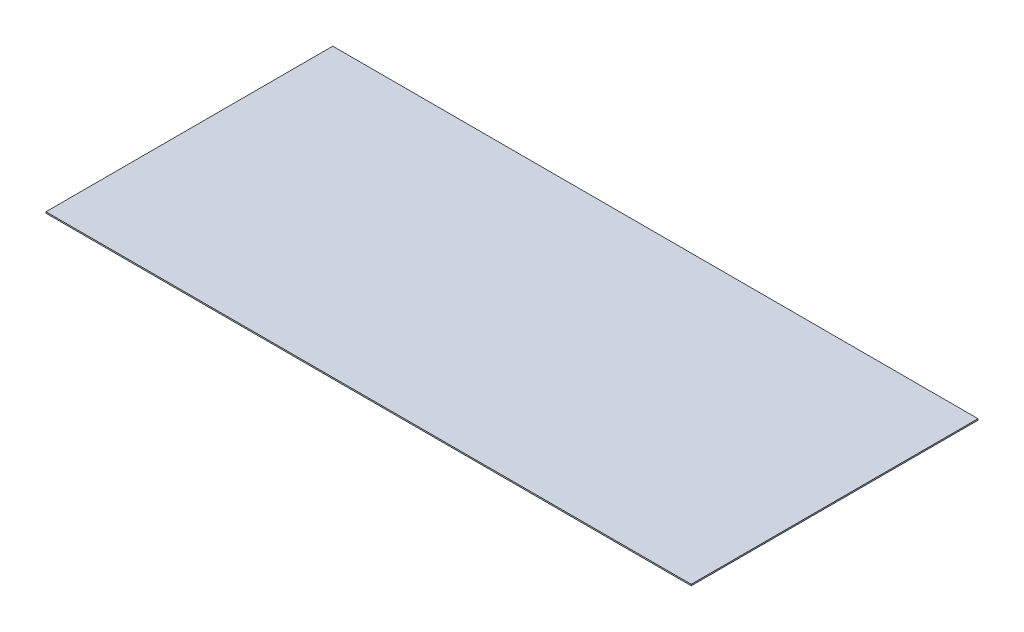
ISO-10303-21;
HEADER;
FILE_DESCRIPTION(('STEP AP214'),'2;1');
FILE_NAME('part.step','',(''),(''),'','','');
FILE_SCHEMA(('AUTOMOTIVE_DESIGN { 1 0 10303 214 1 1 1 1 }'));
ENDSEC;
DATA;
#1=APPLICATION_CONTEXT('core data for automotive mechanical design processes');
#2=APPLICATION_PROTOCOL_DEFINITION('international standard','automotive_design',2000,#1);
#3=PRODUCT_CONTEXT('',#1,'mechanical');
#4=PRODUCT('Part','Part','',(#3));
#5=PRODUCT_RELATED_PRODUCT_CATEGORY('part','',(#4));
#6=PRODUCT_DEFINITION_FORMATION('','',#4);
#7=PRODUCT_DEFINITION_CONTEXT('part definition',#1,'design');
#8=PRODUCT_DEFINITION('design','',#6,#7);
#9=PRODUCT_DEFINITION_SHAPE('','',#8);
#10=(LENGTH_UNIT() NAMED_UNIT(*) SI_UNIT(.MILLI.,.METRE.));
#11=(NAMED_UNIT(*) PLANE_ANGLE_UNIT() SI_UNIT($,.RADIAN.));
#12=(NAMED_UNIT(*) SI_UNIT($,.STERADIAN.) SOLID_ANGLE_UNIT());
#13=UNCERTAINTY_MEASURE_WITH_UNIT(LENGTH_MEASURE(1.E-05),#10,'distance_accuracy_value','');
#14=(GEOMETRIC_REPRESENTATION_CONTEXT(3) GLOBAL_UNCERTAINTY_ASSIGNED_CONTEXT((#13)) GLOBAL_UNIT_ASSIGNED_CONTEXT((#10,
#11,#12)) REPRESENTATION_CONTEXT('',''));
#15=CARTESIAN_POINT('',(0.,0.,0.));
#16=DIRECTION('',(0.,0.,1.));
#17=DIRECTION('',(1.,0.,0.));
#18=AXIS2_PLACEMENT_3D('',#15,#16,#17);
#19=CARTESIAN_POINT('',(450.,1.9,-200.));
#20=DIRECTION('',(-1.,0.,0.));
#21=DIRECTION('',(0.,0.,1.));
#22=AXIS2_PLACEMENT_3D('',#19,#20,#21);
#23=PLANE('',#22);
#24=DIRECTION('',(0.,0.,-1.));
#25=VECTOR('',#24,1.);
#26=CARTESIAN_POINT('',(450.,0.,-200.));
#27=LINE('',#26,#25);
#28=CARTESIAN_POINT('',(450.,0.,200.));
#29=VERTEX_POINT('',#28);
#30=CARTESIAN_POINT('',(450.,0.,-200.));
#31=VERTEX_POINT('',#30);
#32=EDGE_CURVE('E95',#29,#31,#27,.T.);
#33=ORIENTED_EDGE('',*,*,#32,.T.);
#34=DIRECTION('',(0.,-1.,0.));
#35=VECTOR('',#34,1.);
#36=CARTESIAN_POINT('',(450.,1.9,-200.));
#37=LINE('',#36,#35);
#38=CARTESIAN_POINT('',(450.,1.9,-200.));
#39=VERTEX_POINT('',#38);
#40=EDGE_CURVE('E11',#39,#31,#37,.T.);
#41=ORIENTED_EDGE('',*,*,#40,.F.);
#42=DIRECTION('',(0.,0.,-1.));
#43=VECTOR('',#42,1.);
#44=CARTESIAN_POINT('',(450.,1.9,-200.));
#45=LINE('',#44,#43);
#46=CARTESIAN_POINT('',(450.,1.9,200.));
#47=VERTEX_POINT('',#46);
#48=EDGE_CURVE('E83',#47,#39,#45,.T.);
#49=ORIENTED_EDGE('',*,*,#48,.F.);
#50=DIRECTION('',(0.,-1.,0.));
#51=VECTOR('',#50,1.);
#52=CARTESIAN_POINT('',(450.,1.9,200.));
#53=LINE('',#52,#51);
#54=EDGE_CURVE('E91',#47,#29,#53,.T.);
#55=ORIENTED_EDGE('',*,*,#54,.T.);
#56=EDGE_LOOP('',(#33,#41,#49,#55));
#57=FACE_BOUND('',#56,.T.);
#58=ADVANCED_FACE('F32',(#57),#23,.F.);
#59=CARTESIAN_POINT('',(-450.,1.9,-200.));
#60=DIRECTION('',(0.,0.,1.));
#61=DIRECTION('',(1.,0.,0.));
#62=AXIS2_PLACEMENT_3D('',#59,#60,#61);
#63=PLANE('',#62);
#64=DIRECTION('',(-1.,0.,0.));
#65=VECTOR('',#64,1.);
#66=CARTESIAN_POINT('',(-450.,0.,-200.));
#67=LINE('',#66,#65);
#68=CARTESIAN_POINT('',(-450.,0.,-200.));
#69=VERTEX_POINT('',#68);
#70=EDGE_CURVE('E87',#31,#69,#67,.T.);
#71=ORIENTED_EDGE('',*,*,#70,.T.);
#72=DIRECTION('',(0.,-1.,0.));
#73=VECTOR('',#72,1.);
#74=CARTESIAN_POINT('',(-450.,1.9,-200.));
#75=LINE('',#74,#73);
#76=CARTESIAN_POINT('',(-450.,1.9,-200.));
#77=VERTEX_POINT('',#76);
#78=EDGE_CURVE('E40',#77,#69,#75,.T.);
#79=ORIENTED_EDGE('',*,*,#78,.F.);
#80=DIRECTION('',(-1.,0.,0.));
#81=VECTOR('',#80,1.);
#82=CARTESIAN_POINT('',(-450.,1.9,-200.));
#83=LINE('',#82,#81);
#84=EDGE_CURVE('E78',#39,#77,#83,.T.);
#85=ORIENTED_EDGE('',*,*,#84,.F.);
#86=ORIENTED_EDGE('',*,*,#40,.T.);
#87=EDGE_LOOP('',(#71,#79,#85,#86));
#88=FACE_BOUND('',#87,.T.);
#89=ADVANCED_FACE('F86',(#88),#63,.F.);
#90=CARTESIAN_POINT('',(-450.,1.9,-200.));
#91=DIRECTION('',(1.,0.,0.));
#92=DIRECTION('',(0.,0.,-1.));
#93=AXIS2_PLACEMENT_3D('',#90,#91,#92);
#94=PLANE('',#93);
#95=DIRECTION('',(0.,0.,1.));
#96=VECTOR('',#95,1.);
#97=CARTESIAN_POINT('',(-450.,0.,-200.));
#98=LINE('',#97,#96);
#99=CARTESIAN_POINT('',(-450.,0.,200.));
#100=VERTEX_POINT('',#99);
#101=EDGE_CURVE('E65',#69,#100,#98,.T.);
#102=ORIENTED_EDGE('',*,*,#101,.T.);
#103=DIRECTION('',(0.,-1.,0.));
#104=VECTOR('',#103,1.);
#105=CARTESIAN_POINT('',(-450.,1.9,200.));
#106=LINE('',#105,#104);
#107=CARTESIAN_POINT('',(-450.,1.9,200.));
#108=VERTEX_POINT('',#107);
#109=EDGE_CURVE('E88',#108,#100,#106,.T.);
#110=ORIENTED_EDGE('',*,*,#109,.F.);
#111=DIRECTION('',(0.,0.,1.));
#112=VECTOR('',#111,1.);
#113=CARTESIAN_POINT('',(-450.,1.9,-200.));
#114=LINE('',#113,#112);
#115=EDGE_CURVE('E81',#77,#108,#114,.T.);
#116=ORIENTED_EDGE('',*,*,#115,.F.);
#117=ORIENTED_EDGE('',*,*,#78,.T.);
#118=EDGE_LOOP('',(#102,#110,#116,#117));
#119=FACE_BOUND('',#118,.T.);
#120=ADVANCED_FACE('F89',(#119),#94,.F.);
#121=CARTESIAN_POINT('',(-450.,1.9,200.));
#122=DIRECTION('',(0.,0.,-1.));
#123=DIRECTION('',(-1.,0.,0.));
#124=AXIS2_PLACEMENT_3D('',#121,#122,#123);
#125=PLANE('',#124);
#126=DIRECTION('',(1.,0.,0.));
#127=VECTOR('',#126,1.);
#128=CARTESIAN_POINT('',(-450.,0.,200.));
#129=LINE('',#128,#127);
#130=EDGE_CURVE('E71',#100,#29,#129,.T.);
#131=ORIENTED_EDGE('',*,*,#130,.T.);
#132=ORIENTED_EDGE('',*,*,#54,.F.);
#133=DIRECTION('',(1.,0.,0.));
#134=VECTOR('',#133,1.);
#135=CARTESIAN_POINT('',(-450.,1.9,200.));
#136=LINE('',#135,#134);
#137=EDGE_CURVE('E48',#108,#47,#136,.T.);
#138=ORIENTED_EDGE('',*,*,#137,.F.);
#139=ORIENTED_EDGE('',*,*,#109,.T.);
#140=EDGE_LOOP('',(#131,#132,#138,#139));
#141=FACE_BOUND('',#140,.T.);
#142=ADVANCED_FACE('F102',(#141),#125,.F.);
#143=CARTESIAN_POINT('',(0.,1.9,0.));
#144=DIRECTION('',(0.,1.,0.));
#145=DIRECTION('',(0.,0.,1.));
#146=AXIS2_PLACEMENT_3D('',#143,#144,#145);
#147=PLANE('',#146);
#148=ORIENTED_EDGE('',*,*,#48,.T.);
#149=ORIENTED_EDGE('',*,*,#84,.T.);
#150=ORIENTED_EDGE('',*,*,#115,.T.);
#151=ORIENTED_EDGE('',*,*,#137,.T.);
#152=EDGE_LOOP('',(#148,#149,#150,#151));
#153=FACE_BOUND('',#152,.T.);
#154=ADVANCED_FACE('F79',(#153),#147,.T.);
#155=CARTESIAN_POINT('',(0.,0.,0.));
#156=DIRECTION('',(0.,1.,0.));
#157=DIRECTION('',(0.,0.,1.));
#158=AXIS2_PLACEMENT_3D('',#155,#156,#157);
#159=PLANE('',#158);
#160=ORIENTED_EDGE('',*,*,#32,.F.);
#161=ORIENTED_EDGE('',*,*,#130,.F.);
#162=ORIENTED_EDGE('',*,*,#101,.F.);
#163=ORIENTED_EDGE('',*,*,#70,.F.);
#164=EDGE_LOOP('',(#160,#161,#162,#163));
#165=FACE_BOUND('',#164,.T.);
#166=ADVANCED_FACE('F105',(#165),#159,.F.);
#167=CLOSED_SHELL('',(#58,#89,#120,#142,#154,#166));
#168=MANIFOLD_SOLID_BREP('B2',#167);
#169=ADVANCED_BREP_SHAPE_REPRESENTATION('',(#18,#168),#14);
#170=SHAPE_DEFINITION_REPRESENTATION(#9,#169);
ENDSEC;
END-ISO-10303-21;
